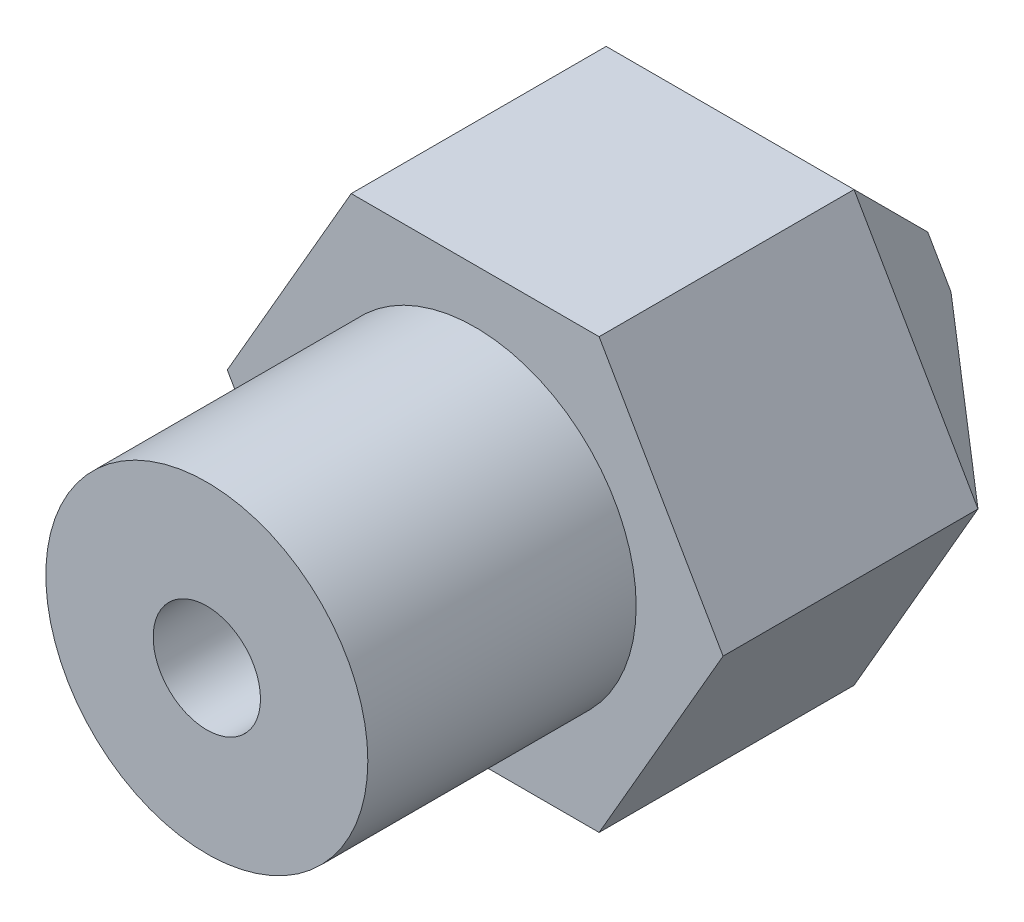
ISO-10303-21;
HEADER;
FILE_DESCRIPTION(('STEP AP214'),'2;1');
FILE_NAME('part.step','',(''),(''),'','','');
FILE_SCHEMA(('AUTOMOTIVE_DESIGN { 1 0 10303 214 1 1 1 1 }'));
ENDSEC;
DATA;
#1=APPLICATION_CONTEXT('core data for automotive mechanical design processes');
#2=APPLICATION_PROTOCOL_DEFINITION('international standard','automotive_design',2000,#1);
#3=PRODUCT_CONTEXT('',#1,'mechanical');
#4=PRODUCT('Part','Part','',(#3));
#5=PRODUCT_RELATED_PRODUCT_CATEGORY('part','',(#4));
#6=PRODUCT_DEFINITION_FORMATION('','',#4);
#7=PRODUCT_DEFINITION_CONTEXT('part definition',#1,'design');
#8=PRODUCT_DEFINITION('design','',#6,#7);
#9=PRODUCT_DEFINITION_SHAPE('','',#8);
#10=(LENGTH_UNIT() NAMED_UNIT(*) SI_UNIT(.MILLI.,.METRE.));
#11=(NAMED_UNIT(*) PLANE_ANGLE_UNIT() SI_UNIT($,.RADIAN.));
#12=(NAMED_UNIT(*) SI_UNIT($,.STERADIAN.) SOLID_ANGLE_UNIT());
#13=UNCERTAINTY_MEASURE_WITH_UNIT(LENGTH_MEASURE(1.E-05),#10,'distance_accuracy_value','');
#14=(GEOMETRIC_REPRESENTATION_CONTEXT(3) GLOBAL_UNCERTAINTY_ASSIGNED_CONTEXT((#13)) GLOBAL_UNIT_ASSIGNED_CONTEXT((#10,
#11,#12)) REPRESENTATION_CONTEXT('',''));
#15=CARTESIAN_POINT('',(0.,0.,0.));
#16=DIRECTION('',(0.,0.,1.));
#17=DIRECTION('',(1.,0.,0.));
#18=AXIS2_PLACEMENT_3D('',#15,#16,#17);
#19=CARTESIAN_POINT('',(2.30940107675855,-3.99999999999998,13.));
#20=DIRECTION('',(-0.866025403784442,0.499999999999995,0.));
#21=DIRECTION('',(-0.499999999999995,-0.866025403784442,0.));
#22=AXIS2_PLACEMENT_3D('',#19,#20,#21);
#23=PLANE('',#22);
#24=DIRECTION('',(0.,0.,-1.));
#25=VECTOR('',#24,1.);
#26=CARTESIAN_POINT('',(2.30940107675855,-3.99999999999998,13.));
#27=LINE('',#26,#25);
#28=CARTESIAN_POINT('',(2.30940107675855,-3.99999999999998,8.));
#29=VERTEX_POINT('',#28);
#30=CARTESIAN_POINT('',(2.30940107675855,-3.99999999999998,3.25));
#31=VERTEX_POINT('',#30);
#32=EDGE_CURVE('E120',#29,#31,#27,.T.);
#33=ORIENTED_EDGE('',*,*,#32,.T.);
#34=DIRECTION('',(0.499999999999995,0.866025403784442,0.));
#35=VECTOR('',#34,1.);
#36=CARTESIAN_POINT('',(2.30940107675855,-3.99999999999998,3.25));
#37=LINE('',#36,#35);
#38=CARTESIAN_POINT('',(4.61880215351701,0.,3.25));
#39=VERTEX_POINT('',#38);
#40=EDGE_CURVE('E11',#31,#39,#37,.T.);
#41=ORIENTED_EDGE('',*,*,#40,.T.);
#42=DIRECTION('',(0.,0.,-1.));
#43=VECTOR('',#42,1.);
#44=CARTESIAN_POINT('',(4.61880215351701,0.,13.));
#45=LINE('',#44,#43);
#46=CARTESIAN_POINT('',(4.61880215351701,0.,8.));
#47=VERTEX_POINT('',#46);
#48=EDGE_CURVE('E116',#47,#39,#45,.T.);
#49=ORIENTED_EDGE('',*,*,#48,.F.);
#50=DIRECTION('',(0.499999999999995,0.866025403784442,0.));
#51=VECTOR('',#50,1.);
#52=CARTESIAN_POINT('',(2.30940107675855,-3.99999999999998,8.));
#53=LINE('',#52,#51);
#54=EDGE_CURVE('E111',#29,#47,#53,.T.);
#55=ORIENTED_EDGE('',*,*,#54,.F.);
#56=EDGE_LOOP('',(#33,#41,#49,#55));
#57=FACE_BOUND('',#56,.T.);
#58=ADVANCED_FACE('F35',(#57),#23,.F.);
#59=CARTESIAN_POINT('',(4.61880215351701,0.,13.));
#60=DIRECTION('',(-0.866025403784438,-0.500000000000001,0.));
#61=DIRECTION('',(0.500000000000001,-0.866025403784438,0.));
#62=AXIS2_PLACEMENT_3D('',#59,#60,#61);
#63=PLANE('',#62);
#64=ORIENTED_EDGE('',*,*,#48,.T.);
#65=DIRECTION('',(-0.500000000000001,0.866025403784438,0.));
#66=VECTOR('',#65,1.);
#67=CARTESIAN_POINT('',(4.61880215351701,0.,3.25));
#68=LINE('',#67,#66);
#69=CARTESIAN_POINT('',(2.3094010767585,4.00000000000001,3.25));
#70=VERTEX_POINT('',#69);
#71=EDGE_CURVE('E115',#39,#70,#68,.T.);
#72=ORIENTED_EDGE('',*,*,#71,.T.);
#73=DIRECTION('',(0.,0.,-1.));
#74=VECTOR('',#73,1.);
#75=CARTESIAN_POINT('',(2.3094010767585,4.00000000000001,13.));
#76=LINE('',#75,#74);
#77=CARTESIAN_POINT('',(2.3094010767585,4.00000000000001,8.));
#78=VERTEX_POINT('',#77);
#79=EDGE_CURVE('E136',#78,#70,#76,.T.);
#80=ORIENTED_EDGE('',*,*,#79,.F.);
#81=DIRECTION('',(-0.500000000000001,0.866025403784438,0.));
#82=VECTOR('',#81,1.);
#83=CARTESIAN_POINT('',(4.61880215351701,0.,8.));
#84=LINE('',#83,#82);
#85=EDGE_CURVE('E123',#47,#78,#84,.T.);
#86=ORIENTED_EDGE('',*,*,#85,.F.);
#87=EDGE_LOOP('',(#64,#72,#80,#86));
#88=FACE_BOUND('',#87,.T.);
#89=ADVANCED_FACE('F200',(#88),#63,.F.);
#90=CARTESIAN_POINT('',(2.3094010767585,4.00000000000001,13.));
#91=DIRECTION('',(0.,-1.,0.));
#92=DIRECTION('',(1.,0.,0.));
#93=AXIS2_PLACEMENT_3D('',#90,#91,#92);
#94=PLANE('',#93);
#95=ORIENTED_EDGE('',*,*,#79,.T.);
#96=DIRECTION('',(-1.,0.,0.));
#97=VECTOR('',#96,1.);
#98=CARTESIAN_POINT('',(2.3094010767585,4.00000000000001,3.25));
#99=LINE('',#98,#97);
#100=CARTESIAN_POINT('',(-2.30940107675852,3.99999999999999,3.25));
#101=VERTEX_POINT('',#100);
#102=EDGE_CURVE('E155',#70,#101,#99,.T.);
#103=ORIENTED_EDGE('',*,*,#102,.T.);
#104=DIRECTION('',(0.,0.,-1.));
#105=VECTOR('',#104,1.);
#106=CARTESIAN_POINT('',(-2.30940107675852,3.99999999999999,13.));
#107=LINE('',#106,#105);
#108=CARTESIAN_POINT('',(-2.30940107675852,3.99999999999999,8.));
#109=VERTEX_POINT('',#108);
#110=EDGE_CURVE('E133',#109,#101,#107,.T.);
#111=ORIENTED_EDGE('',*,*,#110,.F.);
#112=DIRECTION('',(-1.,0.,0.));
#113=VECTOR('',#112,1.);
#114=CARTESIAN_POINT('',(2.3094010767585,4.00000000000001,8.));
#115=LINE('',#114,#113);
#116=EDGE_CURVE('E192',#78,#109,#115,.T.);
#117=ORIENTED_EDGE('',*,*,#116,.F.);
#118=EDGE_LOOP('',(#95,#103,#111,#117));
#119=FACE_BOUND('',#118,.T.);
#120=ADVANCED_FACE('F199',(#119),#94,.F.);
#121=CARTESIAN_POINT('',(-2.30940107675852,3.99999999999999,13.));
#122=DIRECTION('',(0.866025403784441,-0.499999999999995,0.));
#123=DIRECTION('',(0.499999999999995,0.866025403784442,0.));
#124=AXIS2_PLACEMENT_3D('',#121,#122,#123);
#125=PLANE('',#124);
#126=ORIENTED_EDGE('',*,*,#110,.T.);
#127=DIRECTION('',(-0.499999999999995,-0.866025403784442,0.));
#128=VECTOR('',#127,1.);
#129=CARTESIAN_POINT('',(-2.30940107675852,3.99999999999999,3.25));
#130=LINE('',#129,#128);
#131=CARTESIAN_POINT('',(-4.61880215351701,0.,3.25));
#132=VERTEX_POINT('',#131);
#133=EDGE_CURVE('E157',#101,#132,#130,.T.);
#134=ORIENTED_EDGE('',*,*,#133,.T.);
#135=DIRECTION('',(0.,0.,-1.));
#136=VECTOR('',#135,1.);
#137=CARTESIAN_POINT('',(-4.61880215351701,0.,13.));
#138=LINE('',#137,#136);
#139=CARTESIAN_POINT('',(-4.61880215351701,0.,8.));
#140=VERTEX_POINT('',#139);
#141=EDGE_CURVE('E128',#140,#132,#138,.T.);
#142=ORIENTED_EDGE('',*,*,#141,.F.);
#143=DIRECTION('',(-0.499999999999995,-0.866025403784442,0.));
#144=VECTOR('',#143,1.);
#145=CARTESIAN_POINT('',(-2.30940107675852,3.99999999999999,8.));
#146=LINE('',#145,#144);
#147=EDGE_CURVE('E190',#109,#140,#146,.T.);
#148=ORIENTED_EDGE('',*,*,#147,.F.);
#149=EDGE_LOOP('',(#126,#134,#142,#148));
#150=FACE_BOUND('',#149,.T.);
#151=ADVANCED_FACE('F215',(#150),#125,.F.);
#152=CARTESIAN_POINT('',(-4.61880215351701,0.,13.));
#153=DIRECTION('',(0.866025403784434,0.500000000000007,0.));
#154=DIRECTION('',(-0.500000000000007,0.866025403784435,0.));
#155=AXIS2_PLACEMENT_3D('',#152,#153,#154);
#156=PLANE('',#155);
#157=ORIENTED_EDGE('',*,*,#141,.T.);
#158=DIRECTION('',(0.500000000000007,-0.866025403784435,0.));
#159=VECTOR('',#158,1.);
#160=CARTESIAN_POINT('',(-4.61880215351701,0.,3.25));
#161=LINE('',#160,#159);
#162=CARTESIAN_POINT('',(-2.30940107675847,-4.00000000000002,3.25));
#163=VERTEX_POINT('',#162);
#164=EDGE_CURVE('E59',#132,#163,#161,.T.);
#165=ORIENTED_EDGE('',*,*,#164,.T.);
#166=DIRECTION('',(0.,0.,-1.));
#167=VECTOR('',#166,1.);
#168=CARTESIAN_POINT('',(-2.30940107675847,-4.00000000000002,13.));
#169=LINE('',#168,#167);
#170=CARTESIAN_POINT('',(-2.30940107675847,-4.00000000000002,8.));
#171=VERTEX_POINT('',#170);
#172=EDGE_CURVE('E126',#171,#163,#169,.T.);
#173=ORIENTED_EDGE('',*,*,#172,.F.);
#174=DIRECTION('',(0.500000000000007,-0.866025403784435,0.));
#175=VECTOR('',#174,1.);
#176=CARTESIAN_POINT('',(-4.61880215351701,0.,8.));
#177=LINE('',#176,#175);
#178=EDGE_CURVE('E114',#140,#171,#177,.T.);
#179=ORIENTED_EDGE('',*,*,#178,.F.);
#180=EDGE_LOOP('',(#157,#165,#173,#179));
#181=FACE_BOUND('',#180,.T.);
#182=ADVANCED_FACE('F239',(#181),#156,.F.);
#183=CARTESIAN_POINT('',(-2.30940107675847,-4.00000000000002,13.));
#184=DIRECTION('',(0.,1.,0.));
#185=DIRECTION('',(-1.,0.,0.));
#186=AXIS2_PLACEMENT_3D('',#183,#184,#185);
#187=PLANE('',#186);
#188=ORIENTED_EDGE('',*,*,#172,.T.);
#189=DIRECTION('',(1.,0.,0.));
#190=VECTOR('',#189,1.);
#191=CARTESIAN_POINT('',(-2.30940107675847,-4.00000000000002,3.25));
#192=LINE('',#191,#190);
#193=EDGE_CURVE('E44',#163,#31,#192,.T.);
#194=ORIENTED_EDGE('',*,*,#193,.T.);
#195=ORIENTED_EDGE('',*,*,#32,.F.);
#196=DIRECTION('',(1.,0.,0.));
#197=VECTOR('',#196,1.);
#198=CARTESIAN_POINT('',(-2.30940107675847,-4.00000000000002,8.));
#199=LINE('',#198,#197);
#200=EDGE_CURVE('E108',#171,#29,#199,.T.);
#201=ORIENTED_EDGE('',*,*,#200,.F.);
#202=EDGE_LOOP('',(#188,#194,#195,#201));
#203=FACE_BOUND('',#202,.T.);
#204=ADVANCED_FACE('F125',(#203),#187,.F.);
#205=CARTESIAN_POINT('',(0.,0.,0.));
#206=DIRECTION('',(0.,0.,1.));
#207=DIRECTION('',(1.,0.,0.));
#208=AXIS2_PLACEMENT_3D('',#205,#206,#207);
#209=PLANE('',#208);
#210=CARTESIAN_POINT('',(0.,0.,0.));
#211=DIRECTION('',(0.,0.,-1.));
#212=DIRECTION('',(-1.,0.,0.));
#213=AXIS2_PLACEMENT_3D('',#210,#211,#212);
#214=CIRCLE('',#213,0.199999999999999);
#215=CARTESIAN_POINT('',(-0.199999999999999,0.,0.));
#216=VERTEX_POINT('',#215);
#217=EDGE_CURVE('E297',#216,#216,#214,.T.);
#218=ORIENTED_EDGE('',*,*,#217,.F.);
#219=EDGE_LOOP('',(#218));
#220=FACE_BOUND('',#219,.T.);
#221=DIRECTION('',(1.,0.,0.));
#222=VECTOR('',#221,1.);
#223=CARTESIAN_POINT('',(0.,0.749999999999989,0.));
#224=LINE('',#223,#222);
#225=CARTESIAN_POINT('',(-0.433012701892216,0.749999999999988,0.));
#226=VERTEX_POINT('',#225);
#227=CARTESIAN_POINT('',(0.43301270189221,0.749999999999991,0.));
#228=VERTEX_POINT('',#227);
#229=EDGE_CURVE('E150',#226,#228,#224,.T.);
#230=ORIENTED_EDGE('',*,*,#229,.T.);
#231=DIRECTION('',(0.500000000000001,-0.866025403784438,0.));
#232=VECTOR('',#231,1.);
#233=CARTESIAN_POINT('',(0.649519052838318,0.374999999999995,0.));
#234=LINE('',#233,#232);
#235=CARTESIAN_POINT('',(0.866025403784432,0.,0.));
#236=VERTEX_POINT('',#235);
#237=EDGE_CURVE('E152',#228,#236,#234,.T.);
#238=ORIENTED_EDGE('',*,*,#237,.T.);
#239=DIRECTION('',(-0.499999999999995,-0.866025403784442,0.));
#240=VECTOR('',#239,1.);
#241=CARTESIAN_POINT('',(0.649519052838335,-0.374999999999998,0.));
#242=LINE('',#241,#240);
#243=CARTESIAN_POINT('',(0.433012701892235,-0.749999999999985,0.));
#244=VERTEX_POINT('',#243);
#245=EDGE_CURVE('E142',#236,#244,#242,.T.);
#246=ORIENTED_EDGE('',*,*,#245,.T.);
#247=DIRECTION('',(-1.,0.,0.));
#248=VECTOR('',#247,1.);
#249=CARTESIAN_POINT('',(0.,-0.74999999999999,0.));
#250=LINE('',#249,#248);
#251=CARTESIAN_POINT('',(-0.433012701892206,-0.749999999999994,0.));
#252=VERTEX_POINT('',#251);
#253=EDGE_CURVE('E144',#244,#252,#250,.T.);
#254=ORIENTED_EDGE('',*,*,#253,.T.);
#255=DIRECTION('',(-0.500000000000007,0.866025403784435,0.));
#256=VECTOR('',#255,1.);
#257=CARTESIAN_POINT('',(-0.649519052838316,-0.375,0.));
#258=LINE('',#257,#256);
#259=CARTESIAN_POINT('',(-0.866025403784426,0.,0.));
#260=VERTEX_POINT('',#259);
#261=EDGE_CURVE('E146',#252,#260,#258,.T.);
#262=ORIENTED_EDGE('',*,*,#261,.T.);
#263=DIRECTION('',(0.499999999999995,0.866025403784442,0.));
#264=VECTOR('',#263,1.);
#265=CARTESIAN_POINT('',(-0.649519052838321,0.374999999999991,0.));
#266=LINE('',#265,#264);
#267=EDGE_CURVE('E148',#260,#226,#266,.T.);
#268=ORIENTED_EDGE('',*,*,#267,.T.);
#269=EDGE_LOOP('',(#230,#238,#246,#254,#262,#268));
#270=FACE_BOUND('',#269,.T.);
#271=ADVANCED_FACE('F228',(#220,#270),#209,.F.);
#272=CARTESIAN_POINT('',(0.,0.,8.));
#273=DIRECTION('',(0.,0.,1.));
#274=DIRECTION('',(1.,0.,0.));
#275=AXIS2_PLACEMENT_3D('',#272,#273,#274);
#276=PLANE('',#275);
#277=CARTESIAN_POINT('',(0.,0.,8.));
#278=DIRECTION('',(0.,0.,1.));
#279=DIRECTION('',(1.,0.,0.));
#280=AXIS2_PLACEMENT_3D('',#277,#278,#279);
#281=CIRCLE('',#280,3.);
#282=CARTESIAN_POINT('',(3.,0.,8.));
#283=VERTEX_POINT('',#282);
#284=EDGE_CURVE('E181',#283,#283,#281,.T.);
#285=ORIENTED_EDGE('',*,*,#284,.F.);
#286=EDGE_LOOP('',(#285));
#287=FACE_BOUND('',#286,.T.);
#288=ORIENTED_EDGE('',*,*,#54,.T.);
#289=ORIENTED_EDGE('',*,*,#85,.T.);
#290=ORIENTED_EDGE('',*,*,#116,.T.);
#291=ORIENTED_EDGE('',*,*,#147,.T.);
#292=ORIENTED_EDGE('',*,*,#178,.T.);
#293=ORIENTED_EDGE('',*,*,#200,.T.);
#294=EDGE_LOOP('',(#288,#289,#290,#291,#292,#293));
#295=FACE_BOUND('',#294,.T.);
#296=ADVANCED_FACE('F110',(#287,#295),#276,.T.);
#297=CARTESIAN_POINT('',(0.,0.,8.));
#298=DIRECTION('',(0.,0.,1.));
#299=DIRECTION('',(1.,0.,0.));
#300=AXIS2_PLACEMENT_3D('',#297,#298,#299);
#301=CYLINDRICAL_SURFACE('',#300,3.);
#302=ORIENTED_EDGE('',*,*,#284,.T.);
#303=EDGE_LOOP('',(#302));
#304=FACE_BOUND('',#303,.T.);
#305=CARTESIAN_POINT('',(0.,0.,13.));
#306=DIRECTION('',(0.,0.,1.));
#307=DIRECTION('',(1.,0.,0.));
#308=AXIS2_PLACEMENT_3D('',#305,#306,#307);
#309=CIRCLE('',#308,3.);
#310=CARTESIAN_POINT('',(3.,0.,13.));
#311=VERTEX_POINT('',#310);
#312=EDGE_CURVE('E176',#311,#311,#309,.T.);
#313=ORIENTED_EDGE('',*,*,#312,.F.);
#314=EDGE_LOOP('',(#313));
#315=FACE_BOUND('',#314,.T.);
#316=ADVANCED_FACE('F236',(#304,#315),#301,.T.);
#317=CARTESIAN_POINT('',(0.,0.,13.));
#318=DIRECTION('',(0.,0.,1.));
#319=DIRECTION('',(1.,0.,0.));
#320=AXIS2_PLACEMENT_3D('',#317,#318,#319);
#321=PLANE('',#320);
#322=CARTESIAN_POINT('',(0.,0.,13.));
#323=DIRECTION('',(0.,0.,1.));
#324=DIRECTION('',(1.,0.,0.));
#325=AXIS2_PLACEMENT_3D('',#322,#323,#324);
#326=CIRCLE('',#325,0.999999999999999);
#327=CARTESIAN_POINT('',(0.999999999999999,0.,13.));
#328=VERTEX_POINT('',#327);
#329=EDGE_CURVE('E301',#328,#328,#326,.T.);
#330=ORIENTED_EDGE('',*,*,#329,.F.);
#331=EDGE_LOOP('',(#330));
#332=FACE_BOUND('',#331,.T.);
#333=ORIENTED_EDGE('',*,*,#312,.T.);
#334=EDGE_LOOP('',(#333));
#335=FACE_BOUND('',#334,.T.);
#336=ADVANCED_FACE('F263',(#332,#335),#321,.T.);
#337=CARTESIAN_POINT('',(-4.61880215351701,0.,3.25));
#338=DIRECTION('',(0.612372435695791,0.353553390593278,0.707106781186549));
#339=DIRECTION('',(0.500000000000007,-0.866025403784435,0.));
#340=AXIS2_PLACEMENT_3D('',#337,#338,#339);
#341=PLANE('',#340);
#342=DIRECTION('',(0.755928946018456,0.,-0.654653670707976));
#343=VECTOR('',#342,1.);
#344=CARTESIAN_POINT('',(-4.61880215351701,0.,3.25));
#345=LINE('',#344,#343);
#346=EDGE_CURVE('E172',#260,#132,#345,.F.);
#347=ORIENTED_EDGE('',*,*,#346,.F.);
#348=ORIENTED_EDGE('',*,*,#261,.F.);
#349=DIRECTION('',(0.377964473009222,0.654653670707982,-0.654653670707976));
#350=VECTOR('',#349,1.);
#351=CARTESIAN_POINT('',(-2.30940107675847,-4.00000000000002,3.25));
#352=LINE('',#351,#350);
#353=EDGE_CURVE('E174',#163,#252,#352,.T.);
#354=ORIENTED_EDGE('',*,*,#353,.F.);
#355=ORIENTED_EDGE('',*,*,#164,.F.);
#356=EDGE_LOOP('',(#347,#348,#354,#355));
#357=FACE_BOUND('',#356,.T.);
#358=ADVANCED_FACE('F37',(#357),#341,.F.);
#359=CARTESIAN_POINT('',(-2.30940107675847,-4.00000000000002,3.25));
#360=DIRECTION('',(0.,0.707106781186547,0.707106781186549));
#361=DIRECTION('',(1.,0.,0.));
#362=AXIS2_PLACEMENT_3D('',#359,#360,#361);
#363=PLANE('',#362);
#364=ORIENTED_EDGE('',*,*,#353,.T.);
#365=ORIENTED_EDGE('',*,*,#253,.F.);
#366=DIRECTION('',(-0.377964473009233,0.654653670707974,-0.654653670707976));
#367=VECTOR('',#366,1.);
#368=CARTESIAN_POINT('',(2.30940107675855,-3.99999999999998,3.25));
#369=LINE('',#368,#367);
#370=EDGE_CURVE('E169',#31,#244,#369,.T.);
#371=ORIENTED_EDGE('',*,*,#370,.F.);
#372=ORIENTED_EDGE('',*,*,#193,.F.);
#373=EDGE_LOOP('',(#364,#365,#371,#372));
#374=FACE_BOUND('',#373,.T.);
#375=ADVANCED_FACE('F223',(#374),#363,.F.);
#376=CARTESIAN_POINT('',(-2.30940107675852,3.99999999999999,3.25));
#377=DIRECTION('',(0.612372435695796,-0.35355339059327,0.707106781186549));
#378=DIRECTION('',(-0.499999999999995,-0.866025403784442,0.));
#379=AXIS2_PLACEMENT_3D('',#376,#377,#378);
#380=PLANE('',#379);
#381=ORIENTED_EDGE('',*,*,#346,.T.);
#382=ORIENTED_EDGE('',*,*,#133,.F.);
#383=DIRECTION('',(0.377964473009231,-0.654653670707976,-0.654653670707976));
#384=VECTOR('',#383,1.);
#385=CARTESIAN_POINT('',(-2.30940107675852,3.99999999999999,3.25));
#386=LINE('',#385,#384);
#387=EDGE_CURVE('E166',#226,#101,#386,.F.);
#388=ORIENTED_EDGE('',*,*,#387,.F.);
#389=ORIENTED_EDGE('',*,*,#267,.F.);
#390=EDGE_LOOP('',(#381,#382,#388,#389));
#391=FACE_BOUND('',#390,.T.);
#392=ADVANCED_FACE('F218',(#391),#380,.F.);
#393=CARTESIAN_POINT('',(2.30940107675855,-3.99999999999998,3.25));
#394=DIRECTION('',(-0.612372435695796,0.35355339059327,0.707106781186549));
#395=DIRECTION('',(0.499999999999995,0.866025403784442,0.));
#396=AXIS2_PLACEMENT_3D('',#393,#394,#395);
#397=PLANE('',#396);
#398=ORIENTED_EDGE('',*,*,#370,.T.);
#399=ORIENTED_EDGE('',*,*,#245,.F.);
#400=DIRECTION('',(0.755928946018455,0.,0.654653670707977));
#401=VECTOR('',#400,1.);
#402=CARTESIAN_POINT('',(3.29914439536931,0.,2.10714285714287));
#403=LINE('',#402,#401);
#404=EDGE_CURVE('E163',#39,#236,#403,.F.);
#405=ORIENTED_EDGE('',*,*,#404,.F.);
#406=ORIENTED_EDGE('',*,*,#40,.F.);
#407=EDGE_LOOP('',(#398,#399,#405,#406));
#408=FACE_BOUND('',#407,.T.);
#409=ADVANCED_FACE('F226',(#408),#397,.F.);
#410=CARTESIAN_POINT('',(2.3094010767585,4.00000000000001,3.25));
#411=DIRECTION('',(0.,-0.707106781186547,0.707106781186549));
#412=DIRECTION('',(-1.,0.,0.));
#413=AXIS2_PLACEMENT_3D('',#410,#411,#412);
#414=PLANE('',#413);
#415=ORIENTED_EDGE('',*,*,#387,.T.);
#416=ORIENTED_EDGE('',*,*,#102,.F.);
#417=DIRECTION('',(-0.377964473009227,-0.654653670707979,-0.654653670707976));
#418=VECTOR('',#417,1.);
#419=CARTESIAN_POINT('',(2.3094010767585,4.00000000000001,3.25));
#420=LINE('',#419,#418);
#421=EDGE_CURVE('E161',#228,#70,#420,.F.);
#422=ORIENTED_EDGE('',*,*,#421,.F.);
#423=ORIENTED_EDGE('',*,*,#229,.F.);
#424=EDGE_LOOP('',(#415,#416,#422,#423));
#425=FACE_BOUND('',#424,.T.);
#426=ADVANCED_FACE('F211',(#425),#414,.F.);
#427=CARTESIAN_POINT('',(4.61880215351701,0.,3.25));
#428=DIRECTION('',(-0.612372435695793,-0.353553390593274,0.707106781186549));
#429=DIRECTION('',(-0.500000000000001,0.866025403784438,0.));
#430=AXIS2_PLACEMENT_3D('',#427,#428,#429);
#431=PLANE('',#430);
#432=ORIENTED_EDGE('',*,*,#404,.T.);
#433=ORIENTED_EDGE('',*,*,#237,.F.);
#434=ORIENTED_EDGE('',*,*,#421,.T.);
#435=ORIENTED_EDGE('',*,*,#71,.F.);
#436=EDGE_LOOP('',(#432,#433,#434,#435));
#437=FACE_BOUND('',#436,.T.);
#438=ADVANCED_FACE('F204',(#437),#431,.F.);
#439=CARTESIAN_POINT('',(0.,0.,2.4));
#440=DIRECTION('',(0.,0.,1.));
#441=DIRECTION('',(1.,0.,0.));
#442=AXIS2_PLACEMENT_3D('',#439,#440,#441);
#443=CONICAL_SURFACE('',#442,0.999999999999997,1.02974425867665);
#444=CARTESIAN_POINT('',(0.,0.,2.4));
#445=DIRECTION('',(0.,0.,1.));
#446=DIRECTION('',(1.,0.,0.));
#447=AXIS2_PLACEMENT_3D('',#444,#445,#446);
#448=CIRCLE('',#447,0.999999999999997);
#449=CARTESIAN_POINT('',(0.999999999999997,0.,2.4));
#450=VERTEX_POINT('',#449);
#451=EDGE_CURVE('E304',#450,#450,#448,.T.);
#452=ORIENTED_EDGE('',*,*,#451,.T.);
#453=EDGE_LOOP('',(#452));
#454=FACE_BOUND('',#453,.T.);
#455=CARTESIAN_POINT('',(0.,0.,2.24978484524311));
#456=DIRECTION('',(0.,0.,1.));
#457=DIRECTION('',(1.,0.,0.));
#458=AXIS2_PLACEMENT_3D('',#455,#456,#457);
#459=CIRCLE('',#458,0.749999999999998);
#460=CARTESIAN_POINT('',(0.749999999999998,0.,2.24978484524311));
#461=VERTEX_POINT('',#460);
#462=EDGE_CURVE('E39',#461,#461,#459,.T.);
#463=ORIENTED_EDGE('',*,*,#462,.F.);
#464=EDGE_LOOP('',(#463));
#465=FACE_BOUND('',#464,.T.);
#466=ADVANCED_FACE('F253',(#454,#465),#443,.F.);
#467=CARTESIAN_POINT('',(0.,0.,13.));
#468=DIRECTION('',(0.,0.,1.));
#469=DIRECTION('',(1.,0.,0.));
#470=AXIS2_PLACEMENT_3D('',#467,#468,#469);
#471=CYLINDRICAL_SURFACE('',#470,0.999999999999998);
#472=ORIENTED_EDGE('',*,*,#451,.F.);
#473=EDGE_LOOP('',(#472));
#474=FACE_BOUND('',#473,.T.);
#475=ORIENTED_EDGE('',*,*,#329,.T.);
#476=EDGE_LOOP('',(#475));
#477=FACE_BOUND('',#476,.T.);
#478=ADVANCED_FACE('F279',(#474,#477),#471,.F.);
#479=CARTESIAN_POINT('',(0.,0.,0.9));
#480=DIRECTION('',(0.,0.,1.));
#481=DIRECTION('',(1.,0.,0.));
#482=AXIS2_PLACEMENT_3D('',#479,#480,#481);
#483=CONICAL_SURFACE('',#482,0.749999999999997,1.02974425867665);
#484=CARTESIAN_POINT('',(0.,0.,0.569526659534839));
#485=DIRECTION('',(0.,0.,1.));
#486=DIRECTION('',(1.,0.,0.));
#487=AXIS2_PLACEMENT_3D('',#484,#485,#486);
#488=CIRCLE('',#487,0.199999999999999);
#489=CARTESIAN_POINT('',(0.199999999999999,0.,0.569526659534839));
#490=VERTEX_POINT('',#489);
#491=EDGE_CURVE('E300',#490,#490,#488,.F.);
#492=CARTESIAN_POINT('',(0.,0.,0.9));
#493=DIRECTION('',(0.,0.,1.));
#494=DIRECTION('',(1.,0.,0.));
#495=AXIS2_PLACEMENT_3D('',#492,#493,#494);
#496=CIRCLE('',#495,0.749999999999997);
#497=CARTESIAN_POINT('',(0.749999999999997,0.,0.9));
#498=VERTEX_POINT('',#497);
#499=EDGE_CURVE('E164',#498,#498,#496,.T.);
#500=CARTESIAN_POINT('',(0.199999999999999,0.,0.569526659534839));
#501=CARTESIAN_POINT('',(0.205729166666666,0.,0.572969090164685));
#502=CARTESIAN_POINT('',(0.211458333333332,0.,0.57641152079453));
#503=CARTESIAN_POINT('',(0.222916666666666,0.,0.583296382054221));
#504=CARTESIAN_POINT('',(0.228645833333332,0.,0.586738812684066));
#505=CARTESIAN_POINT('',(0.240104166666666,0.,0.593623673943757));
#506=CARTESIAN_POINT('',(0.245833333333332,0.,0.597066104573602));
#507=CARTESIAN_POINT('',(0.257291666666666,0.,0.603950965833293));
#508=CARTESIAN_POINT('',(0.263020833333332,0.,0.607393396463139));
#509=CARTESIAN_POINT('',(0.274479166666666,0.,0.61427825772283));
#510=CARTESIAN_POINT('',(0.280208333333332,0.,0.617720688352675));
#511=CARTESIAN_POINT('',(0.291666666666665,0.,0.624605549612366));
#512=CARTESIAN_POINT('',(0.297395833333332,0.,0.628047980242211));
#513=CARTESIAN_POINT('',(0.308854166666665,0.,0.634932841501902));
#514=CARTESIAN_POINT('',(0.314583333333332,0.,0.638375272131747));
#515=CARTESIAN_POINT('',(0.326041666666665,0.,0.645260133391438));
#516=CARTESIAN_POINT('',(0.331770833333332,0.,0.648702564021284));
#517=CARTESIAN_POINT('',(0.343229166666665,0.,0.655587425280975));
#518=CARTESIAN_POINT('',(0.348958333333332,0.,0.65902985591082));
#519=CARTESIAN_POINT('',(0.360416666666665,0.,0.665914717170511));
#520=CARTESIAN_POINT('',(0.366145833333332,0.,0.669357147800356));
#521=CARTESIAN_POINT('',(0.377604166666665,0.,0.676242009060047));
#522=CARTESIAN_POINT('',(0.383333333333332,0.,0.679684439689893));
#523=CARTESIAN_POINT('',(0.394791666666665,0.,0.686569300949583));
#524=CARTESIAN_POINT('',(0.400520833333332,0.,0.690011731579429));
#525=CARTESIAN_POINT('',(0.411979166666665,0.,0.69689659283912));
#526=CARTESIAN_POINT('',(0.417708333333332,0.,0.700339023468965));
#527=CARTESIAN_POINT('',(0.429166666666665,0.,0.707223884728656));
#528=CARTESIAN_POINT('',(0.434895833333332,0.,0.710666315358501));
#529=CARTESIAN_POINT('',(0.446354166666665,0.,0.717551176618192));
#530=CARTESIAN_POINT('',(0.452083333333331,0.,0.720993607248038));
#531=CARTESIAN_POINT('',(0.463541666666665,0.,0.727878468507729));
#532=CARTESIAN_POINT('',(0.469270833333331,0.,0.731320899137574));
#533=CARTESIAN_POINT('',(0.480729166666665,0.,0.738205760397265));
#534=CARTESIAN_POINT('',(0.486458333333331,0.,0.74164819102711));
#535=CARTESIAN_POINT('',(0.497916666666665,0.,0.748533052286801));
#536=CARTESIAN_POINT('',(0.503645833333331,0.,0.751975482916646));
#537=CARTESIAN_POINT('',(0.515104166666664,0.,0.758860344176337));
#538=CARTESIAN_POINT('',(0.520833333333331,0.,0.762302774806183));
#539=CARTESIAN_POINT('',(0.532291666666664,0.,0.769187636065874));
#540=CARTESIAN_POINT('',(0.538020833333331,0.,0.772630066695719));
#541=CARTESIAN_POINT('',(0.549479166666664,0.,0.77951492795541));
#542=CARTESIAN_POINT('',(0.555208333333331,0.,0.782957358585255));
#543=CARTESIAN_POINT('',(0.566666666666664,0.,0.789842219844946));
#544=CARTESIAN_POINT('',(0.572395833333331,0.,0.793284650474792));
#545=CARTESIAN_POINT('',(0.583854166666664,0.,0.800169511734482));
#546=CARTESIAN_POINT('',(0.589583333333331,0.,0.803611942364328));
#547=CARTESIAN_POINT('',(0.601041666666664,0.,0.810496803624019));
#548=CARTESIAN_POINT('',(0.606770833333331,0.,0.813939234253864));
#549=CARTESIAN_POINT('',(0.618229166666664,0.,0.820824095513555));
#550=CARTESIAN_POINT('',(0.623958333333331,0.,0.8242665261434));
#551=CARTESIAN_POINT('',(0.635416666666664,0.,0.831151387403091));
#552=CARTESIAN_POINT('',(0.641145833333331,0.,0.834593818032937));
#553=CARTESIAN_POINT('',(0.652604166666664,0.,0.841478679292628));
#554=CARTESIAN_POINT('',(0.658333333333331,0.,0.844921109922473));
#555=CARTESIAN_POINT('',(0.669791666666664,0.,0.851805971182164));
#556=CARTESIAN_POINT('',(0.67552083333333,0.,0.855248401812009));
#557=CARTESIAN_POINT('',(0.686979166666664,0.,0.8621332630717));
#558=CARTESIAN_POINT('',(0.69270833333333,0.,0.865575693701546));
#559=CARTESIAN_POINT('',(0.704166666666664,0.,0.872460554961236));
#560=CARTESIAN_POINT('',(0.70989583333333,0.,0.875902985591082));
#561=CARTESIAN_POINT('',(0.721354166666664,0.,0.882787846850773));
#562=CARTESIAN_POINT('',(0.72708333333333,0.,0.886230277480618));
#563=CARTESIAN_POINT('',(0.738541666666664,0.,0.893115138740309));
#564=CARTESIAN_POINT('',(0.74427083333333,0.,0.896557569370154));
#565=CARTESIAN_POINT('',(0.749999999999997,0.,0.9));
#566=B_SPLINE_CURVE_WITH_KNOTS('',3,(#500,#501,#502,#503,#504,#505,#506,#507,#508,#509,#510,
#511,#512,#513,#514,#515,#516,#517,#518,#519,#520,#521,#522,#523,#524,#525,#526,#527,#528,#529,
#530,#531,#532,#533,#534,#535,#536,#537,#538,#539,#540,#541,#542,#543,#544,#545,#546,#547,#548,
#549,#550,#551,#552,#553,#554,#555,#556,#557,#558,#559,#560,#561,#562,#563,#564,#565),
.UNSPECIFIED.,.F.,.F.,(4,2,2,2,2,2,2,2,2,2,2,2,2,2,2,2,2,2,2,2,2,2,2,2,2,2,2,2,2,2,2,2,4),(0.,
0.0200515115146385,0.040103023029277,0.0601545345439155,0.080206046058554,0.100257557573192,
0.120309069087831,0.140360580602469,0.160412092117108,0.180463603631746,0.200515115146385,
0.220566626661023,0.240618138175662,0.2606696496903,0.280721161204939,0.300772672719577,
0.320824184234216,0.340875695748854,0.360927207263492,0.380978718778131,0.401030230292769,
0.421081741807408,0.441133253322046,0.461184764836685,0.481236276351323,0.501287787865962,
0.5213392993806,0.541390810895239,0.561442322409877,0.581493833924515,0.601545345439154,
0.621596856953792,0.641648368468431),.UNSPECIFIED.);
#567=EDGE_CURVE('BSEAM275',#490,#498,#566,.T.);
#568=ORIENTED_EDGE('',*,*,#491,.T.);
#569=ORIENTED_EDGE('',*,*,#499,.T.);
#570=ORIENTED_EDGE('',*,*,#567,.T.);
#571=ORIENTED_EDGE('',*,*,#567,.F.);
#572=EDGE_LOOP('',(#568,#570,#569,#571));
#573=FACE_BOUND('',#572,.T.);
#574=ADVANCED_FACE('F275',(#573),#483,.F.);
#575=CARTESIAN_POINT('',(0.,0.,13.));
#576=DIRECTION('',(0.,0.,1.));
#577=DIRECTION('',(1.,0.,0.));
#578=AXIS2_PLACEMENT_3D('',#575,#576,#577);
#579=CYLINDRICAL_SURFACE('',#578,0.749999999999998);
#580=ORIENTED_EDGE('',*,*,#462,.T.);
#581=EDGE_LOOP('',(#580));
#582=FACE_BOUND('',#581,.T.);
#583=ORIENTED_EDGE('',*,*,#499,.F.);
#584=EDGE_LOOP('',(#583));
#585=FACE_BOUND('',#584,.T.);
#586=ADVANCED_FACE('F278',(#582,#585),#579,.F.);
#587=CARTESIAN_POINT('',(0.,0.,0.));
#588=DIRECTION('',(0.,0.,-1.));
#589=DIRECTION('',(-1.,0.,0.));
#590=AXIS2_PLACEMENT_3D('',#587,#588,#589);
#591=CYLINDRICAL_SURFACE('',#590,0.199999999999999);
#592=ORIENTED_EDGE('',*,*,#217,.T.);
#593=EDGE_LOOP('',(#592));
#594=FACE_BOUND('',#593,.T.);
#595=ORIENTED_EDGE('',*,*,#491,.F.);
#596=EDGE_LOOP('',(#595));
#597=FACE_BOUND('',#596,.T.);
#598=ADVANCED_FACE('F283',(#594,#597),#591,.F.);
#599=CLOSED_SHELL('',(#58,#89,#120,#151,#182,#204,#271,#296,#316,#336,#358,#375,#392,#409,#426,
#438,#466,#478,#574,#586,#598));
#600=MANIFOLD_SOLID_BREP('B2',#599);
#601=ADVANCED_BREP_SHAPE_REPRESENTATION('',(#18,#600),#14);
#602=SHAPE_DEFINITION_REPRESENTATION(#9,#601);
ENDSEC;
END-ISO-10303-21;
